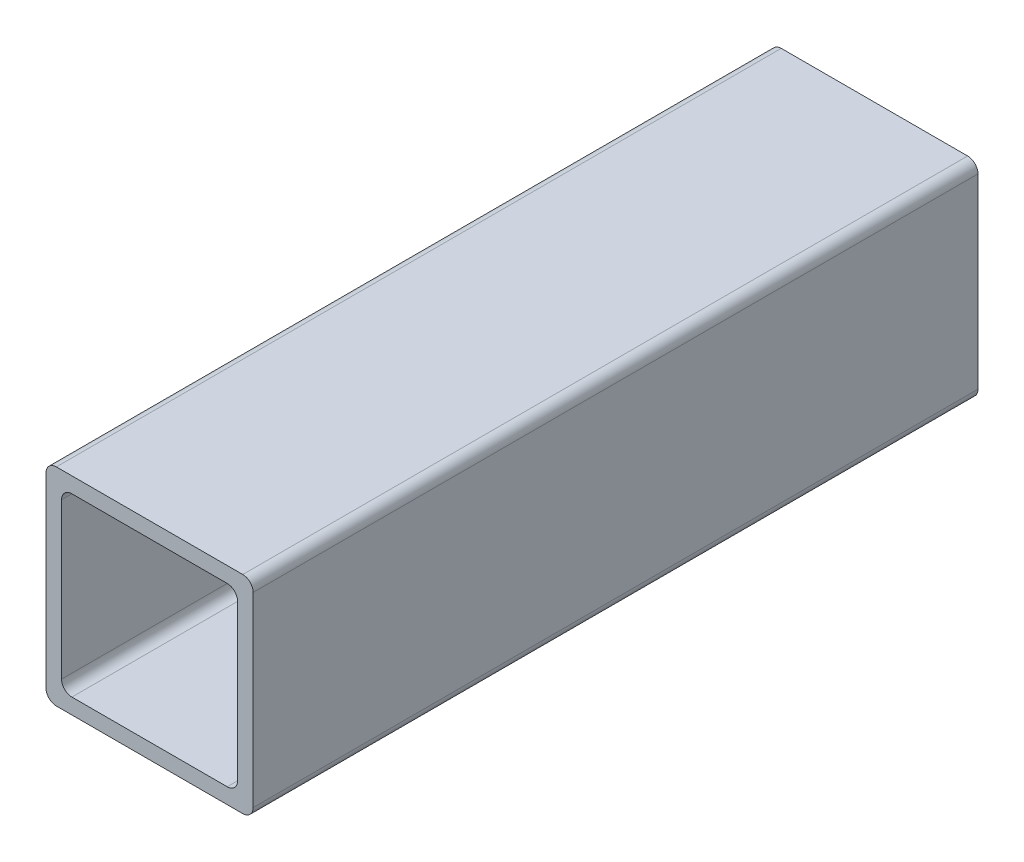
ISO-10303-21;
HEADER;
FILE_DESCRIPTION(('STEP AP214'),'2;1');
FILE_NAME('part.step','',(''),(''),'','','');
FILE_SCHEMA(('AUTOMOTIVE_DESIGN { 1 0 10303 214 1 1 1 1 }'));
ENDSEC;
DATA;
#1=APPLICATION_CONTEXT('core data for automotive mechanical design processes');
#2=APPLICATION_PROTOCOL_DEFINITION('international standard','automotive_design',2000,#1);
#3=PRODUCT_CONTEXT('',#1,'mechanical');
#4=PRODUCT('Part','Part','',(#3));
#5=PRODUCT_RELATED_PRODUCT_CATEGORY('part','',(#4));
#6=PRODUCT_DEFINITION_FORMATION('','',#4);
#7=PRODUCT_DEFINITION_CONTEXT('part definition',#1,'design');
#8=PRODUCT_DEFINITION('design','',#6,#7);
#9=PRODUCT_DEFINITION_SHAPE('','',#8);
#10=(LENGTH_UNIT() NAMED_UNIT(*) SI_UNIT(.MILLI.,.METRE.));
#11=(NAMED_UNIT(*) PLANE_ANGLE_UNIT() SI_UNIT($,.RADIAN.));
#12=(NAMED_UNIT(*) SI_UNIT($,.STERADIAN.) SOLID_ANGLE_UNIT());
#13=UNCERTAINTY_MEASURE_WITH_UNIT(LENGTH_MEASURE(1.E-05),#10,'distance_accuracy_value','');
#14=(GEOMETRIC_REPRESENTATION_CONTEXT(3) GLOBAL_UNCERTAINTY_ASSIGNED_CONTEXT((#13)) GLOBAL_UNIT_ASSIGNED_CONTEXT((#10,
#11,#12)) REPRESENTATION_CONTEXT('',''));
#15=CARTESIAN_POINT('',(0.,0.,0.));
#16=DIRECTION('',(0.,0.,1.));
#17=DIRECTION('',(1.,0.,0.));
#18=AXIS2_PLACEMENT_3D('',#15,#16,#17);
#19=CARTESIAN_POINT('',(20.,-20.,140.));
#20=DIRECTION('',(-1.,0.,0.));
#21=DIRECTION('',(0.,0.,1.));
#22=AXIS2_PLACEMENT_3D('',#19,#20,#21);
#23=PLANE('',#22);
#24=DIRECTION('',(0.,1.,0.));
#25=VECTOR('',#24,1.);
#26=CARTESIAN_POINT('',(20.,-20.,140.));
#27=LINE('',#26,#25);
#28=CARTESIAN_POINT('',(20.,-18.,140.));
#29=VERTEX_POINT('',#28);
#30=CARTESIAN_POINT('',(20.,18.,140.));
#31=VERTEX_POINT('',#30);
#32=EDGE_CURVE('E178',#29,#31,#27,.T.);
#33=ORIENTED_EDGE('',*,*,#32,.F.);
#34=DIRECTION('',(0.,0.,-1.));
#35=VECTOR('',#34,1.);
#36=CARTESIAN_POINT('',(20.,-18.,140.));
#37=LINE('',#36,#35);
#38=CARTESIAN_POINT('',(20.,-18.,0.));
#39=VERTEX_POINT('',#38);
#40=EDGE_CURVE('E206',#29,#39,#37,.T.);
#41=ORIENTED_EDGE('',*,*,#40,.T.);
#42=DIRECTION('',(0.,1.,0.));
#43=VECTOR('',#42,1.);
#44=CARTESIAN_POINT('',(20.,-20.,0.));
#45=LINE('',#44,#43);
#46=CARTESIAN_POINT('',(20.,18.,0.));
#47=VERTEX_POINT('',#46);
#48=EDGE_CURVE('E268',#39,#47,#45,.T.);
#49=ORIENTED_EDGE('',*,*,#48,.T.);
#50=DIRECTION('',(0.,0.,-1.));
#51=VECTOR('',#50,1.);
#52=CARTESIAN_POINT('',(20.,18.,140.));
#53=LINE('',#52,#51);
#54=EDGE_CURVE('E204',#47,#31,#53,.F.);
#55=ORIENTED_EDGE('',*,*,#54,.T.);
#56=EDGE_LOOP('',(#33,#41,#49,#55));
#57=FACE_BOUND('',#56,.T.);
#58=ADVANCED_FACE('F39',(#57),#23,.F.);
#59=CARTESIAN_POINT('',(-20.,20.,140.));
#60=DIRECTION('',(0.,-1.,0.));
#61=DIRECTION('',(0.,0.,-1.));
#62=AXIS2_PLACEMENT_3D('',#59,#60,#61);
#63=PLANE('',#62);
#64=DIRECTION('',(-1.,0.,0.));
#65=VECTOR('',#64,1.);
#66=CARTESIAN_POINT('',(-20.,20.,140.));
#67=LINE('',#66,#65);
#68=CARTESIAN_POINT('',(18.,20.,140.));
#69=VERTEX_POINT('',#68);
#70=CARTESIAN_POINT('',(-18.,20.,140.));
#71=VERTEX_POINT('',#70);
#72=EDGE_CURVE('E182',#69,#71,#67,.T.);
#73=ORIENTED_EDGE('',*,*,#72,.F.);
#74=DIRECTION('',(0.,0.,-1.));
#75=VECTOR('',#74,1.);
#76=CARTESIAN_POINT('',(18.,20.,140.));
#77=LINE('',#76,#75);
#78=CARTESIAN_POINT('',(18.,20.,0.));
#79=VERTEX_POINT('',#78);
#80=EDGE_CURVE('E211',#69,#79,#77,.T.);
#81=ORIENTED_EDGE('',*,*,#80,.T.);
#82=DIRECTION('',(-1.,0.,0.));
#83=VECTOR('',#82,1.);
#84=CARTESIAN_POINT('',(-20.,20.,0.));
#85=LINE('',#84,#83);
#86=CARTESIAN_POINT('',(-18.,20.,0.));
#87=VERTEX_POINT('',#86);
#88=EDGE_CURVE('E184',#79,#87,#85,.T.);
#89=ORIENTED_EDGE('',*,*,#88,.T.);
#90=DIRECTION('',(0.,0.,-1.));
#91=VECTOR('',#90,1.);
#92=CARTESIAN_POINT('',(-18.,20.,140.));
#93=LINE('',#92,#91);
#94=EDGE_CURVE('E209',#87,#71,#93,.F.);
#95=ORIENTED_EDGE('',*,*,#94,.T.);
#96=EDGE_LOOP('',(#73,#81,#89,#95));
#97=FACE_BOUND('',#96,.T.);
#98=ADVANCED_FACE('F292',(#97),#63,.F.);
#99=CARTESIAN_POINT('',(-20.,-20.,140.));
#100=DIRECTION('',(1.,0.,0.));
#101=DIRECTION('',(0.,0.,-1.));
#102=AXIS2_PLACEMENT_3D('',#99,#100,#101);
#103=PLANE('',#102);
#104=DIRECTION('',(0.,-1.,0.));
#105=VECTOR('',#104,1.);
#106=CARTESIAN_POINT('',(-20.,-20.,0.));
#107=LINE('',#106,#105);
#108=CARTESIAN_POINT('',(-20.,18.,0.));
#109=VERTEX_POINT('',#108);
#110=CARTESIAN_POINT('',(-20.,-18.,0.));
#111=VERTEX_POINT('',#110);
#112=EDGE_CURVE('E179',#109,#111,#107,.T.);
#113=ORIENTED_EDGE('',*,*,#112,.T.);
#114=DIRECTION('',(0.,0.,-1.));
#115=VECTOR('',#114,1.);
#116=CARTESIAN_POINT('',(-20.,-18.,140.));
#117=LINE('',#116,#115);
#118=CARTESIAN_POINT('',(-20.,-18.,140.));
#119=VERTEX_POINT('',#118);
#120=EDGE_CURVE('E157',#111,#119,#117,.F.);
#121=ORIENTED_EDGE('',*,*,#120,.T.);
#122=DIRECTION('',(0.,-1.,0.));
#123=VECTOR('',#122,1.);
#124=CARTESIAN_POINT('',(-20.,-20.,140.));
#125=LINE('',#124,#123);
#126=CARTESIAN_POINT('',(-20.,18.,140.));
#127=VERTEX_POINT('',#126);
#128=EDGE_CURVE('E282',#127,#119,#125,.T.);
#129=ORIENTED_EDGE('',*,*,#128,.F.);
#130=DIRECTION('',(0.,0.,-1.));
#131=VECTOR('',#130,1.);
#132=CARTESIAN_POINT('',(-20.,18.,140.));
#133=LINE('',#132,#131);
#134=EDGE_CURVE('E162',#127,#109,#133,.T.);
#135=ORIENTED_EDGE('',*,*,#134,.T.);
#136=EDGE_LOOP('',(#113,#121,#129,#135));
#137=FACE_BOUND('',#136,.T.);
#138=ADVANCED_FACE('F300',(#137),#103,.F.);
#139=CARTESIAN_POINT('',(-20.,-20.,140.));
#140=DIRECTION('',(0.,1.,0.));
#141=DIRECTION('',(0.,0.,1.));
#142=AXIS2_PLACEMENT_3D('',#139,#140,#141);
#143=PLANE('',#142);
#144=DIRECTION('',(1.,0.,0.));
#145=VECTOR('',#144,1.);
#146=CARTESIAN_POINT('',(-20.,-20.,140.));
#147=LINE('',#146,#145);
#148=CARTESIAN_POINT('',(-18.,-20.,140.));
#149=VERTEX_POINT('',#148);
#150=CARTESIAN_POINT('',(18.,-20.,140.));
#151=VERTEX_POINT('',#150);
#152=EDGE_CURVE('E172',#149,#151,#147,.T.);
#153=ORIENTED_EDGE('',*,*,#152,.F.);
#154=DIRECTION('',(0.,0.,-1.));
#155=VECTOR('',#154,1.);
#156=CARTESIAN_POINT('',(-18.,-20.,140.));
#157=LINE('',#156,#155);
#158=CARTESIAN_POINT('',(-18.,-20.,0.));
#159=VERTEX_POINT('',#158);
#160=EDGE_CURVE('E156',#149,#159,#157,.T.);
#161=ORIENTED_EDGE('',*,*,#160,.T.);
#162=DIRECTION('',(1.,0.,0.));
#163=VECTOR('',#162,1.);
#164=CARTESIAN_POINT('',(-20.,-20.,0.));
#165=LINE('',#164,#163);
#166=CARTESIAN_POINT('',(18.,-20.,0.));
#167=VERTEX_POINT('',#166);
#168=EDGE_CURVE('E169',#159,#167,#165,.T.);
#169=ORIENTED_EDGE('',*,*,#168,.T.);
#170=DIRECTION('',(0.,0.,-1.));
#171=VECTOR('',#170,1.);
#172=CARTESIAN_POINT('',(18.,-20.,140.));
#173=LINE('',#172,#171);
#174=EDGE_CURVE('E174',#167,#151,#173,.F.);
#175=ORIENTED_EDGE('',*,*,#174,.T.);
#176=EDGE_LOOP('',(#153,#161,#169,#175));
#177=FACE_BOUND('',#176,.T.);
#178=ADVANCED_FACE('F168',(#177),#143,.F.);
#179=CARTESIAN_POINT('',(0.,0.,140.));
#180=DIRECTION('',(0.,0.,-1.));
#181=DIRECTION('',(-1.,0.,0.));
#182=AXIS2_PLACEMENT_3D('',#179,#180,#181);
#183=PLANE('',#182);
#184=DIRECTION('',(-1.,0.,0.));
#185=VECTOR('',#184,1.);
#186=CARTESIAN_POINT('',(-17.,17.,140.));
#187=LINE('',#186,#185);
#188=CARTESIAN_POINT('',(15.,17.,140.));
#189=VERTEX_POINT('',#188);
#190=CARTESIAN_POINT('',(-15.,17.,140.));
#191=VERTEX_POINT('',#190);
#192=EDGE_CURVE('E250',#189,#191,#187,.T.);
#193=ORIENTED_EDGE('',*,*,#192,.F.);
#194=CARTESIAN_POINT('',(15.,15.,140.));
#195=DIRECTION('',(0.,0.,-1.));
#196=DIRECTION('',(-1.,0.,0.));
#197=AXIS2_PLACEMENT_3D('',#194,#195,#196);
#198=CIRCLE('',#197,2.);
#199=CARTESIAN_POINT('',(17.,15.,140.));
#200=VERTEX_POINT('',#199);
#201=EDGE_CURVE('E237',#189,#200,#198,.T.);
#202=ORIENTED_EDGE('',*,*,#201,.T.);
#203=DIRECTION('',(0.,1.,0.));
#204=VECTOR('',#203,1.);
#205=CARTESIAN_POINT('',(17.,-17.,140.));
#206=LINE('',#205,#204);
#207=CARTESIAN_POINT('',(17.,-15.,140.));
#208=VERTEX_POINT('',#207);
#209=EDGE_CURVE('E259',#208,#200,#206,.T.);
#210=ORIENTED_EDGE('',*,*,#209,.F.);
#211=CARTESIAN_POINT('',(15.,-15.,140.));
#212=DIRECTION('',(0.,0.,-1.));
#213=DIRECTION('',(-1.,0.,0.));
#214=AXIS2_PLACEMENT_3D('',#211,#212,#213);
#215=CIRCLE('',#214,2.);
#216=CARTESIAN_POINT('',(15.,-17.,140.));
#217=VERTEX_POINT('',#216);
#218=EDGE_CURVE('E233',#208,#217,#215,.T.);
#219=ORIENTED_EDGE('',*,*,#218,.T.);
#220=DIRECTION('',(1.,0.,0.));
#221=VECTOR('',#220,1.);
#222=CARTESIAN_POINT('',(-17.,-17.,140.));
#223=LINE('',#222,#221);
#224=CARTESIAN_POINT('',(-15.,-17.,140.));
#225=VERTEX_POINT('',#224);
#226=EDGE_CURVE('E277',#225,#217,#223,.T.);
#227=ORIENTED_EDGE('',*,*,#226,.F.);
#228=CARTESIAN_POINT('',(-15.,-15.,140.));
#229=DIRECTION('',(0.,0.,-1.));
#230=DIRECTION('',(-1.,0.,0.));
#231=AXIS2_PLACEMENT_3D('',#228,#229,#230);
#232=CIRCLE('',#231,2.);
#233=CARTESIAN_POINT('',(-17.,-15.,140.));
#234=VERTEX_POINT('',#233);
#235=EDGE_CURVE('E241',#225,#234,#232,.T.);
#236=ORIENTED_EDGE('',*,*,#235,.T.);
#237=DIRECTION('',(0.,-1.,0.));
#238=VECTOR('',#237,1.);
#239=CARTESIAN_POINT('',(-17.,-17.,140.));
#240=LINE('',#239,#238);
#241=CARTESIAN_POINT('',(-17.,15.,140.));
#242=VERTEX_POINT('',#241);
#243=EDGE_CURVE('E251',#242,#234,#240,.T.);
#244=ORIENTED_EDGE('',*,*,#243,.F.);
#245=CARTESIAN_POINT('',(-15.,15.,140.));
#246=DIRECTION('',(0.,0.,-1.));
#247=DIRECTION('',(-1.,0.,0.));
#248=AXIS2_PLACEMENT_3D('',#245,#246,#247);
#249=CIRCLE('',#248,2.);
#250=EDGE_CURVE('E47',#242,#191,#249,.T.);
#251=ORIENTED_EDGE('',*,*,#250,.T.);
#252=EDGE_LOOP('',(#193,#202,#210,#219,#227,#236,#244,#251));
#253=FACE_BOUND('',#252,.T.);
#254=ORIENTED_EDGE('',*,*,#128,.T.);
#255=CARTESIAN_POINT('',(-18.,-18.,140.));
#256=DIRECTION('',(0.,0.,-1.));
#257=DIRECTION('',(-1.,0.,0.));
#258=AXIS2_PLACEMENT_3D('',#255,#256,#257);
#259=CIRCLE('',#258,2.);
#260=EDGE_CURVE('E202',#119,#149,#259,.F.);
#261=ORIENTED_EDGE('',*,*,#260,.T.);
#262=ORIENTED_EDGE('',*,*,#152,.T.);
#263=CARTESIAN_POINT('',(18.,-18.,140.));
#264=DIRECTION('',(0.,0.,-1.));
#265=DIRECTION('',(-1.,0.,0.));
#266=AXIS2_PLACEMENT_3D('',#263,#264,#265);
#267=CIRCLE('',#266,2.);
#268=EDGE_CURVE('E200',#151,#29,#267,.F.);
#269=ORIENTED_EDGE('',*,*,#268,.T.);
#270=ORIENTED_EDGE('',*,*,#32,.T.);
#271=CARTESIAN_POINT('',(18.,18.,140.));
#272=DIRECTION('',(0.,0.,-1.));
#273=DIRECTION('',(-1.,0.,0.));
#274=AXIS2_PLACEMENT_3D('',#271,#272,#273);
#275=CIRCLE('',#274,2.);
#276=EDGE_CURVE('E198',#31,#69,#275,.F.);
#277=ORIENTED_EDGE('',*,*,#276,.T.);
#278=ORIENTED_EDGE('',*,*,#72,.T.);
#279=CARTESIAN_POINT('',(-18.,18.,140.));
#280=DIRECTION('',(0.,0.,-1.));
#281=DIRECTION('',(-1.,0.,0.));
#282=AXIS2_PLACEMENT_3D('',#279,#280,#281);
#283=CIRCLE('',#282,2.);
#284=EDGE_CURVE('E196',#71,#127,#283,.F.);
#285=ORIENTED_EDGE('',*,*,#284,.T.);
#286=EDGE_LOOP('',(#254,#261,#262,#269,#270,#277,#278,#285));
#287=FACE_BOUND('',#286,.T.);
#288=ADVANCED_FACE('F248',(#253,#287),#183,.F.);
#289=CARTESIAN_POINT('',(0.,0.,0.));
#290=DIRECTION('',(0.,0.,-1.));
#291=DIRECTION('',(-1.,0.,0.));
#292=AXIS2_PLACEMENT_3D('',#289,#290,#291);
#293=PLANE('',#292);
#294=DIRECTION('',(1.,0.,0.));
#295=VECTOR('',#294,1.);
#296=CARTESIAN_POINT('',(-17.,-17.,0.));
#297=LINE('',#296,#295);
#298=CARTESIAN_POINT('',(-15.,-17.,0.));
#299=VERTEX_POINT('',#298);
#300=CARTESIAN_POINT('',(15.,-17.,0.));
#301=VERTEX_POINT('',#300);
#302=EDGE_CURVE('E264',#299,#301,#297,.T.);
#303=ORIENTED_EDGE('',*,*,#302,.T.);
#304=CARTESIAN_POINT('',(15.,-15.,0.));
#305=DIRECTION('',(0.,0.,-1.));
#306=DIRECTION('',(-1.,0.,0.));
#307=AXIS2_PLACEMENT_3D('',#304,#305,#306);
#308=CIRCLE('',#307,2.);
#309=CARTESIAN_POINT('',(17.,-15.,0.));
#310=VERTEX_POINT('',#309);
#311=EDGE_CURVE('E235',#301,#310,#308,.F.);
#312=ORIENTED_EDGE('',*,*,#311,.T.);
#313=DIRECTION('',(0.,1.,0.));
#314=VECTOR('',#313,1.);
#315=CARTESIAN_POINT('',(17.,-17.,0.));
#316=LINE('',#315,#314);
#317=CARTESIAN_POINT('',(17.,15.,0.));
#318=VERTEX_POINT('',#317);
#319=EDGE_CURVE('E270',#310,#318,#316,.T.);
#320=ORIENTED_EDGE('',*,*,#319,.T.);
#321=CARTESIAN_POINT('',(15.,15.,0.));
#322=DIRECTION('',(0.,0.,-1.));
#323=DIRECTION('',(-1.,0.,0.));
#324=AXIS2_PLACEMENT_3D('',#321,#322,#323);
#325=CIRCLE('',#324,2.);
#326=CARTESIAN_POINT('',(15.,17.,0.));
#327=VERTEX_POINT('',#326);
#328=EDGE_CURVE('E239',#318,#327,#325,.F.);
#329=ORIENTED_EDGE('',*,*,#328,.T.);
#330=DIRECTION('',(-1.,0.,0.));
#331=VECTOR('',#330,1.);
#332=CARTESIAN_POINT('',(-17.,17.,0.));
#333=LINE('',#332,#331);
#334=CARTESIAN_POINT('',(-15.,17.,0.));
#335=VERTEX_POINT('',#334);
#336=EDGE_CURVE('E265',#327,#335,#333,.T.);
#337=ORIENTED_EDGE('',*,*,#336,.T.);
#338=CARTESIAN_POINT('',(-15.,15.,0.));
#339=DIRECTION('',(0.,0.,-1.));
#340=DIRECTION('',(-1.,0.,0.));
#341=AXIS2_PLACEMENT_3D('',#338,#339,#340);
#342=CIRCLE('',#341,2.);
#343=CARTESIAN_POINT('',(-17.,15.,0.));
#344=VERTEX_POINT('',#343);
#345=EDGE_CURVE('E11',#335,#344,#342,.F.);
#346=ORIENTED_EDGE('',*,*,#345,.T.);
#347=DIRECTION('',(0.,-1.,0.));
#348=VECTOR('',#347,1.);
#349=CARTESIAN_POINT('',(-17.,-17.,0.));
#350=LINE('',#349,#348);
#351=CARTESIAN_POINT('',(-17.,-15.,0.));
#352=VERTEX_POINT('',#351);
#353=EDGE_CURVE('E262',#344,#352,#350,.T.);
#354=ORIENTED_EDGE('',*,*,#353,.T.);
#355=CARTESIAN_POINT('',(-15.,-15.,0.));
#356=DIRECTION('',(0.,0.,-1.));
#357=DIRECTION('',(-1.,0.,0.));
#358=AXIS2_PLACEMENT_3D('',#355,#356,#357);
#359=CIRCLE('',#358,2.);
#360=EDGE_CURVE('E243',#352,#299,#359,.F.);
#361=ORIENTED_EDGE('',*,*,#360,.T.);
#362=EDGE_LOOP('',(#303,#312,#320,#329,#337,#346,#354,#361));
#363=FACE_BOUND('',#362,.T.);
#364=ORIENTED_EDGE('',*,*,#168,.F.);
#365=CARTESIAN_POINT('',(-18.,-18.,0.));
#366=DIRECTION('',(0.,0.,-1.));
#367=DIRECTION('',(-1.,0.,0.));
#368=AXIS2_PLACEMENT_3D('',#365,#366,#367);
#369=CIRCLE('',#368,2.);
#370=EDGE_CURVE('E152',#159,#111,#369,.T.);
#371=ORIENTED_EDGE('',*,*,#370,.T.);
#372=ORIENTED_EDGE('',*,*,#112,.F.);
#373=CARTESIAN_POINT('',(-18.,18.,0.));
#374=DIRECTION('',(0.,0.,-1.));
#375=DIRECTION('',(-1.,0.,0.));
#376=AXIS2_PLACEMENT_3D('',#373,#374,#375);
#377=CIRCLE('',#376,2.);
#378=EDGE_CURVE('E173',#109,#87,#377,.T.);
#379=ORIENTED_EDGE('',*,*,#378,.T.);
#380=ORIENTED_EDGE('',*,*,#88,.F.);
#381=CARTESIAN_POINT('',(18.,18.,0.));
#382=DIRECTION('',(0.,0.,-1.));
#383=DIRECTION('',(-1.,0.,0.));
#384=AXIS2_PLACEMENT_3D('',#381,#382,#383);
#385=CIRCLE('',#384,2.);
#386=EDGE_CURVE('E190',#79,#47,#385,.T.);
#387=ORIENTED_EDGE('',*,*,#386,.T.);
#388=ORIENTED_EDGE('',*,*,#48,.F.);
#389=CARTESIAN_POINT('',(18.,-18.,0.));
#390=DIRECTION('',(0.,0.,-1.));
#391=DIRECTION('',(-1.,0.,0.));
#392=AXIS2_PLACEMENT_3D('',#389,#390,#391);
#393=CIRCLE('',#392,2.);
#394=EDGE_CURVE('E163',#39,#167,#393,.T.);
#395=ORIENTED_EDGE('',*,*,#394,.T.);
#396=EDGE_LOOP('',(#364,#371,#372,#379,#380,#387,#388,#395));
#397=FACE_BOUND('',#396,.T.);
#398=ADVANCED_FACE('F176',(#363,#397),#293,.T.);
#399=CARTESIAN_POINT('',(17.,-17.,0.));
#400=DIRECTION('',(1.,0.,0.));
#401=DIRECTION('',(0.,0.,-1.));
#402=AXIS2_PLACEMENT_3D('',#399,#400,#401);
#403=PLANE('',#402);
#404=ORIENTED_EDGE('',*,*,#319,.F.);
#405=DIRECTION('',(0.,0.,1.));
#406=VECTOR('',#405,1.);
#407=CARTESIAN_POINT('',(17.,-15.,140.));
#408=LINE('',#407,#406);
#409=EDGE_CURVE('E216',#310,#208,#408,.T.);
#410=ORIENTED_EDGE('',*,*,#409,.T.);
#411=ORIENTED_EDGE('',*,*,#209,.T.);
#412=DIRECTION('',(0.,0.,1.));
#413=VECTOR('',#412,1.);
#414=CARTESIAN_POINT('',(17.,15.,0.));
#415=LINE('',#414,#413);
#416=EDGE_CURVE('E214',#200,#318,#415,.F.);
#417=ORIENTED_EDGE('',*,*,#416,.T.);
#418=EDGE_LOOP('',(#404,#410,#411,#417));
#419=FACE_BOUND('',#418,.T.);
#420=ADVANCED_FACE('F353',(#419),#403,.F.);
#421=CARTESIAN_POINT('',(-17.,-17.,0.));
#422=DIRECTION('',(0.,-1.,0.));
#423=DIRECTION('',(0.,0.,-1.));
#424=AXIS2_PLACEMENT_3D('',#421,#422,#423);
#425=PLANE('',#424);
#426=ORIENTED_EDGE('',*,*,#226,.T.);
#427=DIRECTION('',(0.,0.,1.));
#428=VECTOR('',#427,1.);
#429=CARTESIAN_POINT('',(15.,-17.,0.));
#430=LINE('',#429,#428);
#431=EDGE_CURVE('E222',#217,#301,#430,.F.);
#432=ORIENTED_EDGE('',*,*,#431,.T.);
#433=ORIENTED_EDGE('',*,*,#302,.F.);
#434=DIRECTION('',(0.,0.,1.));
#435=VECTOR('',#434,1.);
#436=CARTESIAN_POINT('',(-15.,-17.,140.));
#437=LINE('',#436,#435);
#438=EDGE_CURVE('E219',#299,#225,#437,.T.);
#439=ORIENTED_EDGE('',*,*,#438,.T.);
#440=EDGE_LOOP('',(#426,#432,#433,#439));
#441=FACE_BOUND('',#440,.T.);
#442=ADVANCED_FACE('F345',(#441),#425,.F.);
#443=CARTESIAN_POINT('',(-17.,-17.,0.));
#444=DIRECTION('',(-1.,0.,0.));
#445=DIRECTION('',(0.,0.,1.));
#446=AXIS2_PLACEMENT_3D('',#443,#444,#445);
#447=PLANE('',#446);
#448=ORIENTED_EDGE('',*,*,#243,.T.);
#449=DIRECTION('',(0.,0.,1.));
#450=VECTOR('',#449,1.);
#451=CARTESIAN_POINT('',(-17.,-15.,0.));
#452=LINE('',#451,#450);
#453=EDGE_CURVE('E54',#234,#352,#452,.F.);
#454=ORIENTED_EDGE('',*,*,#453,.T.);
#455=ORIENTED_EDGE('',*,*,#353,.F.);
#456=DIRECTION('',(0.,0.,1.));
#457=VECTOR('',#456,1.);
#458=CARTESIAN_POINT('',(-17.,15.,140.));
#459=LINE('',#458,#457);
#460=EDGE_CURVE('E229',#344,#242,#459,.T.);
#461=ORIENTED_EDGE('',*,*,#460,.T.);
#462=EDGE_LOOP('',(#448,#454,#455,#461));
#463=FACE_BOUND('',#462,.T.);
#464=ADVANCED_FACE('F261',(#463),#447,.F.);
#465=CARTESIAN_POINT('',(-17.,17.,0.));
#466=DIRECTION('',(0.,1.,0.));
#467=DIRECTION('',(0.,0.,1.));
#468=AXIS2_PLACEMENT_3D('',#465,#466,#467);
#469=PLANE('',#468);
#470=ORIENTED_EDGE('',*,*,#336,.F.);
#471=DIRECTION('',(0.,0.,1.));
#472=VECTOR('',#471,1.);
#473=CARTESIAN_POINT('',(15.,17.,140.));
#474=LINE('',#473,#472);
#475=EDGE_CURVE('E226',#327,#189,#474,.T.);
#476=ORIENTED_EDGE('',*,*,#475,.T.);
#477=ORIENTED_EDGE('',*,*,#192,.T.);
#478=DIRECTION('',(0.,0.,1.));
#479=VECTOR('',#478,1.);
#480=CARTESIAN_POINT('',(-15.,17.,0.));
#481=LINE('',#480,#479);
#482=EDGE_CURVE('E224',#191,#335,#481,.F.);
#483=ORIENTED_EDGE('',*,*,#482,.T.);
#484=EDGE_LOOP('',(#470,#476,#477,#483));
#485=FACE_BOUND('',#484,.T.);
#486=ADVANCED_FACE('F257',(#485),#469,.F.);
#487=CARTESIAN_POINT('',(-18.,-18.,140.));
#488=DIRECTION('',(0.,0.,-1.));
#489=DIRECTION('',(-1.,0.,0.));
#490=AXIS2_PLACEMENT_3D('',#487,#488,#489);
#491=CYLINDRICAL_SURFACE('',#490,2.);
#492=ORIENTED_EDGE('',*,*,#260,.F.);
#493=ORIENTED_EDGE('',*,*,#120,.F.);
#494=ORIENTED_EDGE('',*,*,#370,.F.);
#495=ORIENTED_EDGE('',*,*,#160,.F.);
#496=EDGE_LOOP('',(#492,#493,#494,#495));
#497=FACE_BOUND('',#496,.T.);
#498=ADVANCED_FACE('F155',(#497),#491,.T.);
#499=CARTESIAN_POINT('',(18.,-18.,140.));
#500=DIRECTION('',(0.,0.,-1.));
#501=DIRECTION('',(-1.,0.,0.));
#502=AXIS2_PLACEMENT_3D('',#499,#500,#501);
#503=CYLINDRICAL_SURFACE('',#502,2.);
#504=ORIENTED_EDGE('',*,*,#268,.F.);
#505=ORIENTED_EDGE('',*,*,#174,.F.);
#506=ORIENTED_EDGE('',*,*,#394,.F.);
#507=ORIENTED_EDGE('',*,*,#40,.F.);
#508=EDGE_LOOP('',(#504,#505,#506,#507));
#509=FACE_BOUND('',#508,.T.);
#510=ADVANCED_FACE('F318',(#509),#503,.T.);
#511=CARTESIAN_POINT('',(18.,18.,140.));
#512=DIRECTION('',(0.,0.,-1.));
#513=DIRECTION('',(-1.,0.,0.));
#514=AXIS2_PLACEMENT_3D('',#511,#512,#513);
#515=CYLINDRICAL_SURFACE('',#514,2.);
#516=ORIENTED_EDGE('',*,*,#276,.F.);
#517=ORIENTED_EDGE('',*,*,#54,.F.);
#518=ORIENTED_EDGE('',*,*,#386,.F.);
#519=ORIENTED_EDGE('',*,*,#80,.F.);
#520=EDGE_LOOP('',(#516,#517,#518,#519));
#521=FACE_BOUND('',#520,.T.);
#522=ADVANCED_FACE('F321',(#521),#515,.T.);
#523=CARTESIAN_POINT('',(-18.,18.,140.));
#524=DIRECTION('',(0.,0.,-1.));
#525=DIRECTION('',(-1.,0.,0.));
#526=AXIS2_PLACEMENT_3D('',#523,#524,#525);
#527=CYLINDRICAL_SURFACE('',#526,2.);
#528=ORIENTED_EDGE('',*,*,#284,.F.);
#529=ORIENTED_EDGE('',*,*,#94,.F.);
#530=ORIENTED_EDGE('',*,*,#378,.F.);
#531=ORIENTED_EDGE('',*,*,#134,.F.);
#532=EDGE_LOOP('',(#528,#529,#530,#531));
#533=FACE_BOUND('',#532,.T.);
#534=ADVANCED_FACE('F296',(#533),#527,.T.);
#535=CARTESIAN_POINT('',(15.,-15.,0.));
#536=DIRECTION('',(0.,0.,-1.));
#537=DIRECTION('',(-1.,0.,0.));
#538=AXIS2_PLACEMENT_3D('',#535,#536,#537);
#539=CYLINDRICAL_SURFACE('',#538,2.);
#540=ORIENTED_EDGE('',*,*,#311,.F.);
#541=ORIENTED_EDGE('',*,*,#431,.F.);
#542=ORIENTED_EDGE('',*,*,#218,.F.);
#543=ORIENTED_EDGE('',*,*,#409,.F.);
#544=EDGE_LOOP('',(#540,#541,#542,#543));
#545=FACE_BOUND('',#544,.T.);
#546=ADVANCED_FACE('F328',(#545),#539,.F.);
#547=CARTESIAN_POINT('',(15.,15.,0.));
#548=DIRECTION('',(0.,0.,-1.));
#549=DIRECTION('',(-1.,0.,0.));
#550=AXIS2_PLACEMENT_3D('',#547,#548,#549);
#551=CYLINDRICAL_SURFACE('',#550,2.);
#552=ORIENTED_EDGE('',*,*,#328,.F.);
#553=ORIENTED_EDGE('',*,*,#416,.F.);
#554=ORIENTED_EDGE('',*,*,#201,.F.);
#555=ORIENTED_EDGE('',*,*,#475,.F.);
#556=EDGE_LOOP('',(#552,#553,#554,#555));
#557=FACE_BOUND('',#556,.T.);
#558=ADVANCED_FACE('F331',(#557),#551,.F.);
#559=CARTESIAN_POINT('',(-15.,-15.,0.));
#560=DIRECTION('',(0.,0.,-1.));
#561=DIRECTION('',(-1.,0.,0.));
#562=AXIS2_PLACEMENT_3D('',#559,#560,#561);
#563=CYLINDRICAL_SURFACE('',#562,2.);
#564=ORIENTED_EDGE('',*,*,#360,.F.);
#565=ORIENTED_EDGE('',*,*,#453,.F.);
#566=ORIENTED_EDGE('',*,*,#235,.F.);
#567=ORIENTED_EDGE('',*,*,#438,.F.);
#568=EDGE_LOOP('',(#564,#565,#566,#567));
#569=FACE_BOUND('',#568,.T.);
#570=ADVANCED_FACE('F334',(#569),#563,.F.);
#571=CARTESIAN_POINT('',(-15.,15.,0.));
#572=DIRECTION('',(0.,0.,-1.));
#573=DIRECTION('',(-1.,0.,0.));
#574=AXIS2_PLACEMENT_3D('',#571,#572,#573);
#575=CYLINDRICAL_SURFACE('',#574,2.);
#576=ORIENTED_EDGE('',*,*,#345,.F.);
#577=ORIENTED_EDGE('',*,*,#482,.F.);
#578=ORIENTED_EDGE('',*,*,#250,.F.);
#579=ORIENTED_EDGE('',*,*,#460,.F.);
#580=EDGE_LOOP('',(#576,#577,#578,#579));
#581=FACE_BOUND('',#580,.T.);
#582=ADVANCED_FACE('F41',(#581),#575,.F.);
#583=CLOSED_SHELL('',(#58,#98,#138,#178,#288,#398,#420,#442,#464,#486,#498,#510,#522,#534,#546,
#558,#570,#582));
#584=MANIFOLD_SOLID_BREP('B2',#583);
#585=ADVANCED_BREP_SHAPE_REPRESENTATION('',(#18,#584),#14);
#586=SHAPE_DEFINITION_REPRESENTATION(#9,#585);
ENDSEC;
END-ISO-10303-21;
